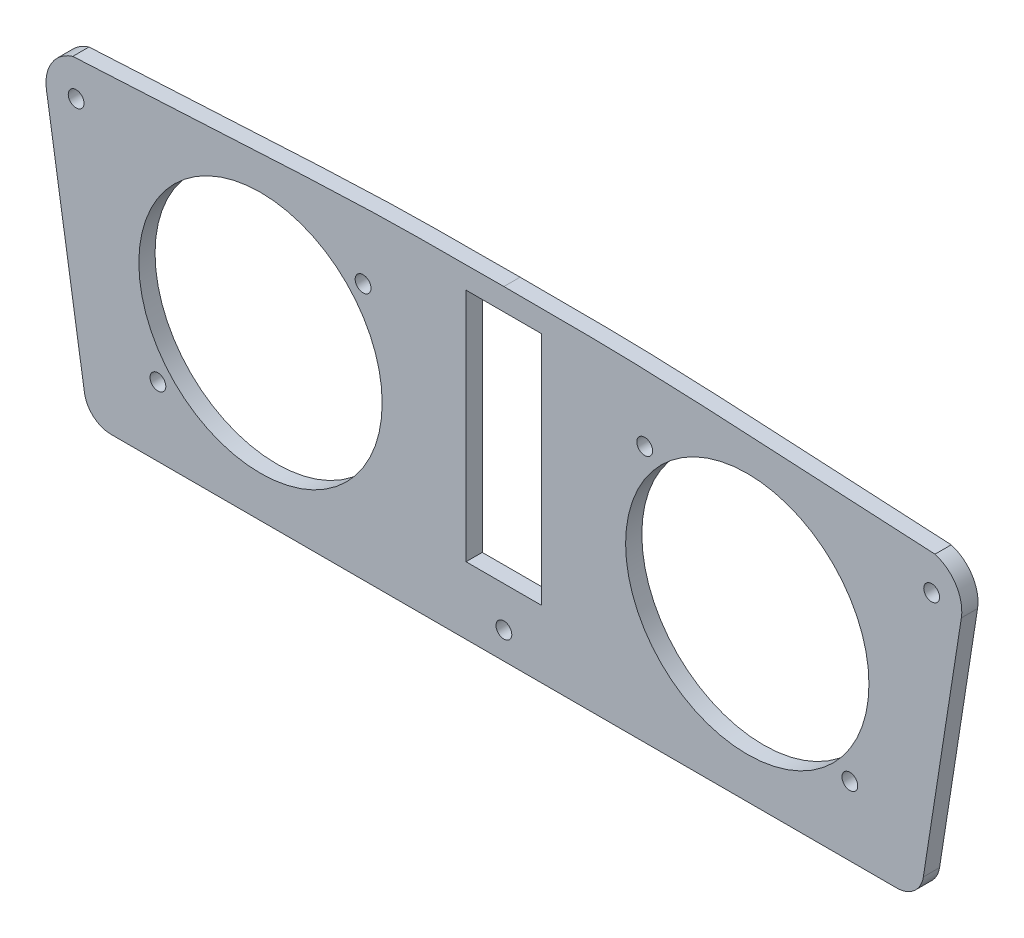
ISO-10303-21;
HEADER;
FILE_DESCRIPTION(('STEP AP214'),'2;1');
FILE_NAME('part.step','',(''),(''),'','','');
FILE_SCHEMA(('AUTOMOTIVE_DESIGN { 1 0 10303 214 1 1 1 1 }'));
ENDSEC;
DATA;
#1=APPLICATION_CONTEXT('core data for automotive mechanical design processes');
#2=APPLICATION_PROTOCOL_DEFINITION('international standard','automotive_design',2000,#1);
#3=PRODUCT_CONTEXT('',#1,'mechanical');
#4=PRODUCT('Part','Part','',(#3));
#5=PRODUCT_RELATED_PRODUCT_CATEGORY('part','',(#4));
#6=PRODUCT_DEFINITION_FORMATION('','',#4);
#7=PRODUCT_DEFINITION_CONTEXT('part definition',#1,'design');
#8=PRODUCT_DEFINITION('design','',#6,#7);
#9=PRODUCT_DEFINITION_SHAPE('','',#8);
#10=(LENGTH_UNIT() NAMED_UNIT(*) SI_UNIT(.MILLI.,.METRE.));
#11=(NAMED_UNIT(*) PLANE_ANGLE_UNIT() SI_UNIT($,.RADIAN.));
#12=(NAMED_UNIT(*) SI_UNIT($,.STERADIAN.) SOLID_ANGLE_UNIT());
#13=UNCERTAINTY_MEASURE_WITH_UNIT(LENGTH_MEASURE(1.E-05),#10,'distance_accuracy_value','');
#14=(GEOMETRIC_REPRESENTATION_CONTEXT(3) GLOBAL_UNCERTAINTY_ASSIGNED_CONTEXT((#13)) GLOBAL_UNIT_ASSIGNED_CONTEXT((#10,
#11,#12)) REPRESENTATION_CONTEXT('',''));
#15=CARTESIAN_POINT('',(0.,0.,0.));
#16=DIRECTION('',(0.,0.,1.));
#17=DIRECTION('',(1.,0.,0.));
#18=AXIS2_PLACEMENT_3D('',#15,#16,#17);
#19=CARTESIAN_POINT('',(77.6729384432531,7.59154105312176,3.));
#20=DIRECTION('',(0.,0.,1.));
#21=DIRECTION('',(1.,0.,0.));
#22=AXIS2_PLACEMENT_3D('',#19,#20,#21);
#23=PLANE('',#22);
#24=DIRECTION('',(0.,1.,0.));
#25=VECTOR('',#24,1.);
#26=CARTESIAN_POINT('',(7.,-30.2884590840889,3.));
#27=LINE('',#26,#25);
#28=CARTESIAN_POINT('',(7.,-30.2884590840889,3.));
#29=VERTEX_POINT('',#28);
#30=CARTESIAN_POINT('',(6.99999999999999,13.2106393625238,3.));
#31=VERTEX_POINT('',#30);
#32=EDGE_CURVE('E48',#29,#31,#27,.T.);
#33=ORIENTED_EDGE('',*,*,#32,.F.);
#34=DIRECTION('',(1.,0.,0.));
#35=VECTOR('',#34,1.);
#36=CARTESIAN_POINT('',(-7.,-30.2884590840889,3.));
#37=LINE('',#36,#35);
#38=CARTESIAN_POINT('',(-7.,-30.2884590840889,3.));
#39=VERTEX_POINT('',#38);
#40=EDGE_CURVE('E146',#39,#29,#37,.T.);
#41=ORIENTED_EDGE('',*,*,#40,.F.);
#42=DIRECTION('',(0.,-1.,0.));
#43=VECTOR('',#42,1.);
#44=CARTESIAN_POINT('',(-7.00000000000001,13.2106393625237,3.));
#45=LINE('',#44,#43);
#46=CARTESIAN_POINT('',(-7.00000000000001,13.2106393625237,3.));
#47=VERTEX_POINT('',#46);
#48=EDGE_CURVE('E131',#47,#39,#45,.T.);
#49=ORIENTED_EDGE('',*,*,#48,.F.);
#50=DIRECTION('',(-1.,0.,0.));
#51=VECTOR('',#50,1.);
#52=CARTESIAN_POINT('',(0.,13.2106393625237,3.));
#53=LINE('',#52,#51);
#54=EDGE_CURVE('E139',#31,#47,#53,.T.);
#55=ORIENTED_EDGE('',*,*,#54,.F.);
#56=EDGE_LOOP('',(#33,#41,#49,#55));
#57=FACE_BOUND('',#56,.T.);
#58=CARTESIAN_POINT('',(79.0964854551662,7.80060452720305,3.));
#59=DIRECTION('',(0.,0.,-1.));
#60=DIRECTION('',(-1.,0.,0.));
#61=AXIS2_PLACEMENT_3D('',#58,#59,#60);
#62=CIRCLE('',#61,1.46049999999999);
#63=CARTESIAN_POINT('',(77.6359854551662,7.80060452720305,3.));
#64=VERTEX_POINT('',#63);
#65=EDGE_CURVE('E158',#64,#64,#62,.T.);
#66=ORIENTED_EDGE('',*,*,#65,.T.);
#67=EDGE_LOOP('',(#66));
#68=FACE_BOUND('',#67,.T.);
#69=CARTESIAN_POINT('',(77.6729384432531,7.59154105312176,3.));
#70=DIRECTION('',(0.,0.,1.));
#71=DIRECTION('',(1.,0.,0.));
#72=AXIS2_PLACEMENT_3D('',#69,#70,#71);
#73=CIRCLE('',#72,7.);
#74=CARTESIAN_POINT('',(84.5890874100609,6.51131724810564,3.));
#75=VERTEX_POINT('',#74);
#76=CARTESIAN_POINT('',(79.7182282278267,14.2860753683015,3.));
#77=VERTEX_POINT('',#76);
#78=EDGE_CURVE('E210',#75,#77,#73,.T.);
#79=ORIENTED_EDGE('',*,*,#78,.T.);
#80=CARTESIAN_POINT('',(79.7182282278267,14.2860753683015,3.));
#81=CARTESIAN_POINT('',(25.,17.2860753683015,3.));
#82=CARTESIAN_POINT('',(0.,17.2860753683015,3.));
#83=(BOUNDED_CURVE() B_SPLINE_CURVE(2,(#80,#81,#82),.UNSPECIFIED.,.F.,
.F.) B_SPLINE_CURVE_WITH_KNOTS((3,3),(0.,1.),
.UNSPECIFIED.) CURVE() GEOMETRIC_REPRESENTATION_ITEM() RATIONAL_B_SPLINE_CURVE((1.,3.,1.)) REPRESENTATION_ITEM(''));
#84=CARTESIAN_POINT('',(0.,17.2860753683015,3.));
#85=VERTEX_POINT('',#84);
#86=EDGE_CURVE('E213',#77,#85,#83,.T.);
#87=ORIENTED_EDGE('',*,*,#86,.T.);
#88=CARTESIAN_POINT('',(-79.7182282278267,14.2860753683015,3.));
#89=CARTESIAN_POINT('',(-25.,17.2860753683015,3.));
#90=CARTESIAN_POINT('',(0.,17.2860753683015,3.));
#91=(BOUNDED_CURVE() B_SPLINE_CURVE(2,(#88,#89,#90),.UNSPECIFIED.,.F.,
.F.) B_SPLINE_CURVE_WITH_KNOTS((3,3),(0.,1.),
.UNSPECIFIED.) CURVE() GEOMETRIC_REPRESENTATION_ITEM() RATIONAL_B_SPLINE_CURVE((1.,3.,1.)) REPRESENTATION_ITEM(''));
#92=CARTESIAN_POINT('',(-79.7182282278267,14.2860753683015,3.));
#93=VERTEX_POINT('',#92);
#94=EDGE_CURVE('E219',#93,#85,#91,.T.);
#95=ORIENTED_EDGE('',*,*,#94,.F.);
#96=CARTESIAN_POINT('',(-77.6729384432531,7.59154105312176,3.));
#97=DIRECTION('',(0.,0.,-1.));
#98=DIRECTION('',(-1.,0.,0.));
#99=AXIS2_PLACEMENT_3D('',#96,#97,#98);
#100=CIRCLE('',#99,7.);
#101=CARTESIAN_POINT('',(-84.5890874100609,6.51131724810564,3.));
#102=VERTEX_POINT('',#101);
#103=EDGE_CURVE('E386',#102,#93,#100,.T.);
#104=ORIENTED_EDGE('',*,*,#103,.F.);
#105=DIRECTION('',(-0.154317686430875,0.988021280972542,0.));
#106=VECTOR('',#105,1.);
#107=CARTESIAN_POINT('',(-77.5610943048627,-38.4855130638528,3.));
#108=LINE('',#107,#106);
#109=CARTESIAN_POINT('',(-77.5610943048627,-38.4855130638528,3.));
#110=VERTEX_POINT('',#109);
#111=EDGE_CURVE('E384',#110,#102,#108,.T.);
#112=ORIENTED_EDGE('',*,*,#111,.F.);
#113=CARTESIAN_POINT('',(-72.6209879,-37.7139246316985,3.));
#114=DIRECTION('',(0.,0.,1.));
#115=DIRECTION('',(1.,0.,0.));
#116=AXIS2_PLACEMENT_3D('',#113,#114,#115);
#117=CIRCLE('',#116,5.00000000000001);
#118=CARTESIAN_POINT('',(-72.6209879,-42.7139246316985,3.));
#119=VERTEX_POINT('',#118);
#120=EDGE_CURVE('E382',#110,#119,#117,.T.);
#121=ORIENTED_EDGE('',*,*,#120,.T.);
#122=DIRECTION('',(-1.,0.,0.));
#123=VECTOR('',#122,1.);
#124=CARTESIAN_POINT('',(72.6209879,-42.7139246316985,3.));
#125=LINE('',#124,#123);
#126=CARTESIAN_POINT('',(72.6209879,-42.7139246316985,3.));
#127=VERTEX_POINT('',#126);
#128=EDGE_CURVE('E379',#127,#119,#125,.T.);
#129=ORIENTED_EDGE('',*,*,#128,.F.);
#130=CARTESIAN_POINT('',(72.6209879,-37.7139246316985,3.));
#131=DIRECTION('',(0.,0.,-1.));
#132=DIRECTION('',(-1.,0.,0.));
#133=AXIS2_PLACEMENT_3D('',#130,#131,#132);
#134=CIRCLE('',#133,5.00000000000001);
#135=CARTESIAN_POINT('',(77.5610943048627,-38.4855130638528,3.));
#136=VERTEX_POINT('',#135);
#137=EDGE_CURVE('E376',#136,#127,#134,.T.);
#138=ORIENTED_EDGE('',*,*,#137,.F.);
#139=DIRECTION('',(0.154317686430875,0.988021280972542,0.));
#140=VECTOR('',#139,1.);
#141=CARTESIAN_POINT('',(77.5610943048627,-38.4855130638528,3.));
#142=LINE('',#141,#140);
#143=EDGE_CURVE('E340',#136,#75,#142,.T.);
#144=ORIENTED_EDGE('',*,*,#143,.T.);
#145=EDGE_LOOP('',(#79,#87,#95,#104,#112,#121,#129,#138,#144));
#146=FACE_BOUND('',#145,.T.);
#147=CARTESIAN_POINT('',(-45.0049677878614,-12.6314974895042,3.));
#148=DIRECTION('',(0.,0.,1.));
#149=DIRECTION('',(1.,0.,0.));
#150=AXIS2_PLACEMENT_3D('',#147,#148,#149);
#151=CIRCLE('',#150,22.5000000000002);
#152=CARTESIAN_POINT('',(-22.5049677878613,-12.6314974895042,3.));
#153=VERTEX_POINT('',#152);
#154=EDGE_CURVE('E201',#153,#153,#151,.T.);
#155=ORIENTED_EDGE('',*,*,#154,.F.);
#156=EDGE_LOOP('',(#155));
#157=FACE_BOUND('',#156,.T.);
#158=CARTESIAN_POINT('',(45.0049677878612,-12.6314974895042,3.));
#159=DIRECTION('',(0.,0.,1.));
#160=DIRECTION('',(1.,0.,0.));
#161=AXIS2_PLACEMENT_3D('',#158,#159,#160);
#162=CIRCLE('',#161,22.4999999997435);
#163=CARTESIAN_POINT('',(67.5049677876047,-12.6314974895042,3.));
#164=VERTEX_POINT('',#163);
#165=EDGE_CURVE('E197',#164,#164,#162,.T.);
#166=ORIENTED_EDGE('',*,*,#165,.F.);
#167=EDGE_LOOP('',(#166));
#168=FACE_BOUND('',#167,.T.);
#169=CARTESIAN_POINT('',(63.9727498389549,-29.9725829244534,3.));
#170=DIRECTION('',(0.,0.,-1.));
#171=DIRECTION('',(-1.,0.,0.));
#172=AXIS2_PLACEMENT_3D('',#169,#170,#171);
#173=CIRCLE('',#172,1.46049999999999);
#174=CARTESIAN_POINT('',(62.5122498389549,-29.9725829244534,3.));
#175=VERTEX_POINT('',#174);
#176=EDGE_CURVE('E194',#175,#175,#173,.T.);
#177=ORIENTED_EDGE('',*,*,#176,.T.);
#178=EDGE_LOOP('',(#177));
#179=FACE_BOUND('',#178,.T.);
#180=CARTESIAN_POINT('',(26.0371857367675,4.70958794544504,3.));
#181=DIRECTION('',(0.,0.,-1.));
#182=DIRECTION('',(-1.,0.,0.));
#183=AXIS2_PLACEMENT_3D('',#180,#181,#182);
#184=CIRCLE('',#183,1.46049999999999);
#185=CARTESIAN_POINT('',(24.5766857367675,4.70958794544504,3.));
#186=VERTEX_POINT('',#185);
#187=EDGE_CURVE('E188',#186,#186,#184,.T.);
#188=ORIENTED_EDGE('',*,*,#187,.T.);
#189=EDGE_LOOP('',(#188));
#190=FACE_BOUND('',#189,.T.);
#191=CARTESIAN_POINT('',(-63.9727498389549,-29.9725829244534,3.));
#192=DIRECTION('',(0.,0.,-1.));
#193=DIRECTION('',(-1.,0.,0.));
#194=AXIS2_PLACEMENT_3D('',#191,#192,#193);
#195=CIRCLE('',#194,1.46049999999999);
#196=CARTESIAN_POINT('',(-65.4332498389549,-29.9725829244534,3.));
#197=VERTEX_POINT('',#196);
#198=EDGE_CURVE('E182',#197,#197,#195,.T.);
#199=ORIENTED_EDGE('',*,*,#198,.T.);
#200=EDGE_LOOP('',(#199));
#201=FACE_BOUND('',#200,.T.);
#202=CARTESIAN_POINT('',(-26.0371857367678,4.70958794544512,3.));
#203=DIRECTION('',(0.,0.,-1.));
#204=DIRECTION('',(-1.,0.,0.));
#205=AXIS2_PLACEMENT_3D('',#202,#203,#204);
#206=CIRCLE('',#205,1.46049999999999);
#207=CARTESIAN_POINT('',(-27.4976857367678,4.70958794544512,3.));
#208=VERTEX_POINT('',#207);
#209=EDGE_CURVE('E176',#208,#208,#206,.T.);
#210=ORIENTED_EDGE('',*,*,#209,.T.);
#211=EDGE_LOOP('',(#210));
#212=FACE_BOUND('',#211,.T.);
#213=CARTESIAN_POINT('',(0.,-37.7139246316985,3.));
#214=DIRECTION('',(0.,0.,-1.));
#215=DIRECTION('',(-1.,0.,0.));
#216=AXIS2_PLACEMENT_3D('',#213,#214,#215);
#217=CIRCLE('',#216,1.46049999999999);
#218=CARTESIAN_POINT('',(-1.46049999999999,-37.7139246316985,3.));
#219=VERTEX_POINT('',#218);
#220=EDGE_CURVE('E170',#219,#219,#217,.T.);
#221=ORIENTED_EDGE('',*,*,#220,.T.);
#222=EDGE_LOOP('',(#221));
#223=FACE_BOUND('',#222,.T.);
#224=CARTESIAN_POINT('',(-79.0964854551671,7.80060452721007,3.));
#225=DIRECTION('',(0.,0.,-1.));
#226=DIRECTION('',(-1.,0.,0.));
#227=AXIS2_PLACEMENT_3D('',#224,#225,#226);
#228=CIRCLE('',#227,1.46049999999999);
#229=CARTESIAN_POINT('',(-80.5569854551671,7.80060452721007,3.));
#230=VERTEX_POINT('',#229);
#231=EDGE_CURVE('E164',#230,#230,#228,.T.);
#232=ORIENTED_EDGE('',*,*,#231,.T.);
#233=EDGE_LOOP('',(#232));
#234=FACE_BOUND('',#233,.T.);
#235=ADVANCED_FACE('F33',(#57,#68,#146,#157,#168,#179,#190,#201,#212,#223,#234),#23,.T.);
#236=CARTESIAN_POINT('',(77.6729384432531,7.59154105312176,0.));
#237=DIRECTION('',(0.,0.,1.));
#238=DIRECTION('',(1.,0.,0.));
#239=AXIS2_PLACEMENT_3D('',#236,#237,#238);
#240=PLANE('',#239);
#241=DIRECTION('',(1.,0.,0.));
#242=VECTOR('',#241,1.);
#243=CARTESIAN_POINT('',(77.6729384432531,-30.2884590840889,0.));
#244=LINE('',#243,#242);
#245=CARTESIAN_POINT('',(-7.,-30.2884590840889,0.));
#246=VERTEX_POINT('',#245);
#247=CARTESIAN_POINT('',(7.,-30.2884590840889,0.));
#248=VERTEX_POINT('',#247);
#249=EDGE_CURVE('E41',#246,#248,#244,.T.);
#250=ORIENTED_EDGE('',*,*,#249,.T.);
#251=DIRECTION('',(0.,1.,0.));
#252=VECTOR('',#251,1.);
#253=CARTESIAN_POINT('',(6.99999999999999,7.59154105312177,0.));
#254=LINE('',#253,#252);
#255=CARTESIAN_POINT('',(7.,13.2106393625237,0.));
#256=VERTEX_POINT('',#255);
#257=EDGE_CURVE('E11',#248,#256,#254,.T.);
#258=ORIENTED_EDGE('',*,*,#257,.T.);
#259=DIRECTION('',(-1.,0.,0.));
#260=VECTOR('',#259,1.);
#261=CARTESIAN_POINT('',(77.672938443253,13.2106393625242,0.));
#262=LINE('',#261,#260);
#263=CARTESIAN_POINT('',(-7.00000000000001,13.2106393625237,0.));
#264=VERTEX_POINT('',#263);
#265=EDGE_CURVE('E316',#256,#264,#262,.T.);
#266=ORIENTED_EDGE('',*,*,#265,.T.);
#267=DIRECTION('',(0.,-1.,0.));
#268=VECTOR('',#267,1.);
#269=CARTESIAN_POINT('',(-7.00000000000001,7.59154105312175,0.));
#270=LINE('',#269,#268);
#271=EDGE_CURVE('E134',#264,#246,#270,.T.);
#272=ORIENTED_EDGE('',*,*,#271,.T.);
#273=EDGE_LOOP('',(#250,#258,#266,#272));
#274=FACE_BOUND('',#273,.T.);
#275=CARTESIAN_POINT('',(79.0964854551662,7.80060452720305,0.));
#276=DIRECTION('',(0.,0.,-1.));
#277=DIRECTION('',(-1.,0.,0.));
#278=AXIS2_PLACEMENT_3D('',#275,#276,#277);
#279=CIRCLE('',#278,1.46049999999999);
#280=CARTESIAN_POINT('',(77.6359854551662,7.80060452720305,0.));
#281=VERTEX_POINT('',#280);
#282=EDGE_CURVE('E152',#281,#281,#279,.T.);
#283=ORIENTED_EDGE('',*,*,#282,.F.);
#284=EDGE_LOOP('',(#283));
#285=FACE_BOUND('',#284,.T.);
#286=CARTESIAN_POINT('',(-79.0964854551671,7.80060452721007,0.));
#287=DIRECTION('',(0.,0.,-1.));
#288=DIRECTION('',(-1.,0.,0.));
#289=AXIS2_PLACEMENT_3D('',#286,#287,#288);
#290=CIRCLE('',#289,1.46049999999999);
#291=CARTESIAN_POINT('',(-80.5569854551671,7.80060452721007,0.));
#292=VERTEX_POINT('',#291);
#293=EDGE_CURVE('E161',#292,#292,#290,.T.);
#294=ORIENTED_EDGE('',*,*,#293,.F.);
#295=EDGE_LOOP('',(#294));
#296=FACE_BOUND('',#295,.T.);
#297=CARTESIAN_POINT('',(0.,-37.7139246316985,0.));
#298=DIRECTION('',(0.,0.,-1.));
#299=DIRECTION('',(-1.,0.,0.));
#300=AXIS2_PLACEMENT_3D('',#297,#298,#299);
#301=CIRCLE('',#300,1.46049999999999);
#302=CARTESIAN_POINT('',(-1.46049999999999,-37.7139246316985,0.));
#303=VERTEX_POINT('',#302);
#304=EDGE_CURVE('E167',#303,#303,#301,.T.);
#305=ORIENTED_EDGE('',*,*,#304,.F.);
#306=EDGE_LOOP('',(#305));
#307=FACE_BOUND('',#306,.T.);
#308=CARTESIAN_POINT('',(-26.0371857367678,4.70958794544512,0.));
#309=DIRECTION('',(0.,0.,-1.));
#310=DIRECTION('',(-1.,0.,0.));
#311=AXIS2_PLACEMENT_3D('',#308,#309,#310);
#312=CIRCLE('',#311,1.46049999999999);
#313=CARTESIAN_POINT('',(-27.4976857367678,4.70958794544512,0.));
#314=VERTEX_POINT('',#313);
#315=EDGE_CURVE('E173',#314,#314,#312,.T.);
#316=ORIENTED_EDGE('',*,*,#315,.F.);
#317=EDGE_LOOP('',(#316));
#318=FACE_BOUND('',#317,.T.);
#319=CARTESIAN_POINT('',(-63.9727498389549,-29.9725829244534,0.));
#320=DIRECTION('',(0.,0.,-1.));
#321=DIRECTION('',(-1.,0.,0.));
#322=AXIS2_PLACEMENT_3D('',#319,#320,#321);
#323=CIRCLE('',#322,1.46049999999999);
#324=CARTESIAN_POINT('',(-65.4332498389549,-29.9725829244534,0.));
#325=VERTEX_POINT('',#324);
#326=EDGE_CURVE('E179',#325,#325,#323,.T.);
#327=ORIENTED_EDGE('',*,*,#326,.F.);
#328=EDGE_LOOP('',(#327));
#329=FACE_BOUND('',#328,.T.);
#330=CARTESIAN_POINT('',(45.0049677878612,-12.6314974895042,0.));
#331=DIRECTION('',(0.,0.,1.));
#332=DIRECTION('',(1.,0.,0.));
#333=AXIS2_PLACEMENT_3D('',#330,#331,#332);
#334=CIRCLE('',#333,22.4999999997435);
#335=CARTESIAN_POINT('',(67.5049677876047,-12.6314974895042,0.));
#336=VERTEX_POINT('',#335);
#337=EDGE_CURVE('E198',#336,#336,#334,.T.);
#338=ORIENTED_EDGE('',*,*,#337,.T.);
#339=EDGE_LOOP('',(#338));
#340=FACE_BOUND('',#339,.T.);
#341=CARTESIAN_POINT('',(-45.0049677878614,-12.6314974895042,0.));
#342=DIRECTION('',(0.,0.,1.));
#343=DIRECTION('',(1.,0.,0.));
#344=AXIS2_PLACEMENT_3D('',#341,#342,#343);
#345=CIRCLE('',#344,22.5000000000002);
#346=CARTESIAN_POINT('',(-22.5049677878613,-12.6314974895042,0.));
#347=VERTEX_POINT('',#346);
#348=EDGE_CURVE('E204',#347,#347,#345,.T.);
#349=ORIENTED_EDGE('',*,*,#348,.T.);
#350=EDGE_LOOP('',(#349));
#351=FACE_BOUND('',#350,.T.);
#352=CARTESIAN_POINT('',(77.6729384432531,7.59154105312176,0.));
#353=DIRECTION('',(0.,0.,1.));
#354=DIRECTION('',(1.,0.,0.));
#355=AXIS2_PLACEMENT_3D('',#352,#353,#354);
#356=CIRCLE('',#355,7.);
#357=CARTESIAN_POINT('',(84.5890874100609,6.51131724810564,0.));
#358=VERTEX_POINT('',#357);
#359=CARTESIAN_POINT('',(79.7182282278267,14.2860753683015,0.));
#360=VERTEX_POINT('',#359);
#361=EDGE_CURVE('E207',#358,#360,#356,.T.);
#362=ORIENTED_EDGE('',*,*,#361,.F.);
#363=DIRECTION('',(0.154317686430875,0.988021280972542,0.));
#364=VECTOR('',#363,1.);
#365=CARTESIAN_POINT('',(77.5610943048627,-38.4855130638528,0.));
#366=LINE('',#365,#364);
#367=CARTESIAN_POINT('',(77.5610943048627,-38.4855130638528,0.));
#368=VERTEX_POINT('',#367);
#369=EDGE_CURVE('E214',#368,#358,#366,.T.);
#370=ORIENTED_EDGE('',*,*,#369,.F.);
#371=CARTESIAN_POINT('',(72.6209879,-37.7139246316985,0.));
#372=DIRECTION('',(0.,0.,-1.));
#373=DIRECTION('',(-1.,0.,0.));
#374=AXIS2_PLACEMENT_3D('',#371,#372,#373);
#375=CIRCLE('',#374,5.00000000000001);
#376=CARTESIAN_POINT('',(72.6209879,-42.7139246316985,0.));
#377=VERTEX_POINT('',#376);
#378=EDGE_CURVE('E342',#368,#377,#375,.T.);
#379=ORIENTED_EDGE('',*,*,#378,.T.);
#380=DIRECTION('',(-1.,0.,0.));
#381=VECTOR('',#380,1.);
#382=CARTESIAN_POINT('',(72.6209879,-42.7139246316985,0.));
#383=LINE('',#382,#381);
#384=CARTESIAN_POINT('',(-72.6209879,-42.7139246316985,0.));
#385=VERTEX_POINT('',#384);
#386=EDGE_CURVE('E345',#377,#385,#383,.T.);
#387=ORIENTED_EDGE('',*,*,#386,.T.);
#388=CARTESIAN_POINT('',(-72.6209879,-37.7139246316985,0.));
#389=DIRECTION('',(0.,0.,1.));
#390=DIRECTION('',(1.,0.,0.));
#391=AXIS2_PLACEMENT_3D('',#388,#389,#390);
#392=CIRCLE('',#391,5.00000000000001);
#393=CARTESIAN_POINT('',(-77.5610943048627,-38.4855130638528,0.));
#394=VERTEX_POINT('',#393);
#395=EDGE_CURVE('E348',#394,#385,#392,.T.);
#396=ORIENTED_EDGE('',*,*,#395,.F.);
#397=DIRECTION('',(-0.154317686430875,0.988021280972542,0.));
#398=VECTOR('',#397,1.);
#399=CARTESIAN_POINT('',(-77.5610943048627,-38.4855130638528,0.));
#400=LINE('',#399,#398);
#401=CARTESIAN_POINT('',(-84.5890874100609,6.51131724810564,0.));
#402=VERTEX_POINT('',#401);
#403=EDGE_CURVE('E351',#394,#402,#400,.T.);
#404=ORIENTED_EDGE('',*,*,#403,.T.);
#405=CARTESIAN_POINT('',(-77.6729384432531,7.59154105312176,0.));
#406=DIRECTION('',(0.,0.,-1.));
#407=DIRECTION('',(-1.,0.,0.));
#408=AXIS2_PLACEMENT_3D('',#405,#406,#407);
#409=CIRCLE('',#408,7.);
#410=CARTESIAN_POINT('',(-79.7182282278267,14.2860753683015,0.));
#411=VERTEX_POINT('',#410);
#412=EDGE_CURVE('E354',#402,#411,#409,.T.);
#413=ORIENTED_EDGE('',*,*,#412,.T.);
#414=CARTESIAN_POINT('',(-79.7182282278267,14.2860753683015,0.));
#415=CARTESIAN_POINT('',(-25.,17.2860753683015,0.));
#416=CARTESIAN_POINT('',(0.,17.2860753683015,0.));
#417=(BOUNDED_CURVE() B_SPLINE_CURVE(2,(#414,#415,#416),.UNSPECIFIED.,.F.,
.F.) B_SPLINE_CURVE_WITH_KNOTS((3,3),(0.,1.),
.UNSPECIFIED.) CURVE() GEOMETRIC_REPRESENTATION_ITEM() RATIONAL_B_SPLINE_CURVE((1.,3.,1.)) REPRESENTATION_ITEM(''));
#418=CARTESIAN_POINT('',(0.,17.2860753683015,0.));
#419=VERTEX_POINT('',#418);
#420=EDGE_CURVE('E357',#411,#419,#417,.T.);
#421=ORIENTED_EDGE('',*,*,#420,.T.);
#422=CARTESIAN_POINT('',(79.7182282278267,14.2860753683015,0.));
#423=CARTESIAN_POINT('',(25.,17.2860753683015,0.));
#424=CARTESIAN_POINT('',(0.,17.2860753683015,0.));
#425=(BOUNDED_CURVE() B_SPLINE_CURVE(2,(#422,#423,#424),.UNSPECIFIED.,.F.,
.F.) B_SPLINE_CURVE_WITH_KNOTS((3,3),(0.,1.),
.UNSPECIFIED.) CURVE() GEOMETRIC_REPRESENTATION_ITEM() RATIONAL_B_SPLINE_CURVE((1.,3.,1.)) REPRESENTATION_ITEM(''));
#426=EDGE_CURVE('E362',#360,#419,#425,.T.);
#427=ORIENTED_EDGE('',*,*,#426,.F.);
#428=EDGE_LOOP('',(#362,#370,#379,#387,#396,#404,#413,#421,#427));
#429=FACE_BOUND('',#428,.T.);
#430=CARTESIAN_POINT('',(63.9727498389549,-29.9725829244534,0.));
#431=DIRECTION('',(0.,0.,-1.));
#432=DIRECTION('',(-1.,0.,0.));
#433=AXIS2_PLACEMENT_3D('',#430,#431,#432);
#434=CIRCLE('',#433,1.46049999999999);
#435=CARTESIAN_POINT('',(62.5122498389549,-29.9725829244534,0.));
#436=VERTEX_POINT('',#435);
#437=EDGE_CURVE('E191',#436,#436,#434,.T.);
#438=ORIENTED_EDGE('',*,*,#437,.F.);
#439=EDGE_LOOP('',(#438));
#440=FACE_BOUND('',#439,.T.);
#441=CARTESIAN_POINT('',(26.0371857367675,4.70958794544504,0.));
#442=DIRECTION('',(0.,0.,-1.));
#443=DIRECTION('',(-1.,0.,0.));
#444=AXIS2_PLACEMENT_3D('',#441,#442,#443);
#445=CIRCLE('',#444,1.46049999999999);
#446=CARTESIAN_POINT('',(24.5766857367675,4.70958794544504,0.));
#447=VERTEX_POINT('',#446);
#448=EDGE_CURVE('E185',#447,#447,#445,.T.);
#449=ORIENTED_EDGE('',*,*,#448,.F.);
#450=EDGE_LOOP('',(#449));
#451=FACE_BOUND('',#450,.T.);
#452=ADVANCED_FACE('F260',(#274,#285,#296,#307,#318,#329,#340,#351,#429,#440,#451),#240,.F.);
#453=CARTESIAN_POINT('',(77.6729384432531,7.59154105312176,3.));
#454=DIRECTION('',(0.,0.,-1.));
#455=DIRECTION('',(-1.,0.,0.));
#456=AXIS2_PLACEMENT_3D('',#453,#454,#455);
#457=CYLINDRICAL_SURFACE('',#456,7.);
#458=ORIENTED_EDGE('',*,*,#361,.T.);
#459=DIRECTION('',(0.,0.,-1.));
#460=VECTOR('',#459,1.);
#461=CARTESIAN_POINT('',(79.7182282278267,14.2860753683015,3.));
#462=LINE('',#461,#460);
#463=EDGE_CURVE('E318',#77,#360,#462,.T.);
#464=ORIENTED_EDGE('',*,*,#463,.F.);
#465=ORIENTED_EDGE('',*,*,#78,.F.);
#466=DIRECTION('',(0.,0.,-1.));
#467=VECTOR('',#466,1.);
#468=CARTESIAN_POINT('',(84.5890874100609,6.51131724810564,3.));
#469=LINE('',#468,#467);
#470=EDGE_CURVE('E337',#75,#358,#469,.T.);
#471=ORIENTED_EDGE('',*,*,#470,.T.);
#472=EDGE_LOOP('',(#458,#464,#465,#471));
#473=FACE_BOUND('',#472,.T.);
#474=ADVANCED_FACE('F35',(#473),#457,.T.);
#475=DIRECTION('',(0.,0.,-1.));
#476=VECTOR('',#475,1.);
#477=SURFACE_OF_LINEAR_EXTRUSION('',#83,#476);
#478=ORIENTED_EDGE('',*,*,#426,.T.);
#479=DIRECTION('',(0.,0.,-1.));
#480=VECTOR('',#479,1.);
#481=CARTESIAN_POINT('',(0.,17.2860753683015,3.));
#482=LINE('',#481,#480);
#483=EDGE_CURVE('E323',#85,#419,#482,.T.);
#484=ORIENTED_EDGE('',*,*,#483,.F.);
#485=ORIENTED_EDGE('',*,*,#86,.F.);
#486=ORIENTED_EDGE('',*,*,#463,.T.);
#487=EDGE_LOOP('',(#478,#484,#485,#486));
#488=FACE_BOUND('',#487,.T.);
#489=ADVANCED_FACE('F227',(#488),#477,.F.);
#490=DIRECTION('',(0.,0.,-1.));
#491=VECTOR('',#490,1.);
#492=SURFACE_OF_LINEAR_EXTRUSION('',#91,#491);
#493=ORIENTED_EDGE('',*,*,#420,.F.);
#494=DIRECTION('',(0.,0.,-1.));
#495=VECTOR('',#494,1.);
#496=CARTESIAN_POINT('',(-79.7182282278267,14.2860753683015,3.));
#497=LINE('',#496,#495);
#498=EDGE_CURVE('E325',#93,#411,#497,.T.);
#499=ORIENTED_EDGE('',*,*,#498,.F.);
#500=ORIENTED_EDGE('',*,*,#94,.T.);
#501=ORIENTED_EDGE('',*,*,#483,.T.);
#502=EDGE_LOOP('',(#493,#499,#500,#501));
#503=FACE_BOUND('',#502,.T.);
#504=ADVANCED_FACE('F230',(#503),#492,.T.);
#505=CARTESIAN_POINT('',(-77.6729384432531,7.59154105312176,3.));
#506=DIRECTION('',(0.,0.,-1.));
#507=DIRECTION('',(-1.,0.,0.));
#508=AXIS2_PLACEMENT_3D('',#505,#506,#507);
#509=CYLINDRICAL_SURFACE('',#508,7.);
#510=ORIENTED_EDGE('',*,*,#412,.F.);
#511=DIRECTION('',(0.,0.,-1.));
#512=VECTOR('',#511,1.);
#513=CARTESIAN_POINT('',(-84.5890874100609,6.51131724810564,3.));
#514=LINE('',#513,#512);
#515=EDGE_CURVE('E327',#102,#402,#514,.T.);
#516=ORIENTED_EDGE('',*,*,#515,.F.);
#517=ORIENTED_EDGE('',*,*,#103,.T.);
#518=ORIENTED_EDGE('',*,*,#498,.T.);
#519=EDGE_LOOP('',(#510,#516,#517,#518));
#520=FACE_BOUND('',#519,.T.);
#521=ADVANCED_FACE('F234',(#520),#509,.T.);
#522=CARTESIAN_POINT('',(-77.5610943048627,-38.4855130638528,3.));
#523=DIRECTION('',(-0.988021280972542,-0.154317686430875,0.));
#524=DIRECTION('',(0.154317686430875,-0.988021280972542,0.));
#525=AXIS2_PLACEMENT_3D('',#522,#523,#524);
#526=PLANE('',#525);
#527=ORIENTED_EDGE('',*,*,#403,.F.);
#528=DIRECTION('',(0.,0.,-1.));
#529=VECTOR('',#528,1.);
#530=CARTESIAN_POINT('',(-77.5610943048627,-38.4855130638528,3.));
#531=LINE('',#530,#529);
#532=EDGE_CURVE('E329',#110,#394,#531,.T.);
#533=ORIENTED_EDGE('',*,*,#532,.F.);
#534=ORIENTED_EDGE('',*,*,#111,.T.);
#535=ORIENTED_EDGE('',*,*,#515,.T.);
#536=EDGE_LOOP('',(#527,#533,#534,#535));
#537=FACE_BOUND('',#536,.T.);
#538=ADVANCED_FACE('F238',(#537),#526,.T.);
#539=CARTESIAN_POINT('',(-72.6209879,-37.7139246316985,3.));
#540=DIRECTION('',(0.,0.,-1.));
#541=DIRECTION('',(-1.,0.,0.));
#542=AXIS2_PLACEMENT_3D('',#539,#540,#541);
#543=CYLINDRICAL_SURFACE('',#542,5.00000000000001);
#544=ORIENTED_EDGE('',*,*,#395,.T.);
#545=DIRECTION('',(0.,0.,-1.));
#546=VECTOR('',#545,1.);
#547=CARTESIAN_POINT('',(-72.6209879,-42.7139246316985,3.));
#548=LINE('',#547,#546);
#549=EDGE_CURVE('E331',#119,#385,#548,.T.);
#550=ORIENTED_EDGE('',*,*,#549,.F.);
#551=ORIENTED_EDGE('',*,*,#120,.F.);
#552=ORIENTED_EDGE('',*,*,#532,.T.);
#553=EDGE_LOOP('',(#544,#550,#551,#552));
#554=FACE_BOUND('',#553,.T.);
#555=ADVANCED_FACE('F242',(#554),#543,.T.);
#556=CARTESIAN_POINT('',(72.6209879,-42.7139246316985,3.));
#557=DIRECTION('',(0.,-1.,0.));
#558=DIRECTION('',(0.,0.,-1.));
#559=AXIS2_PLACEMENT_3D('',#556,#557,#558);
#560=PLANE('',#559);
#561=ORIENTED_EDGE('',*,*,#386,.F.);
#562=DIRECTION('',(0.,0.,-1.));
#563=VECTOR('',#562,1.);
#564=CARTESIAN_POINT('',(72.6209879,-42.7139246316985,3.));
#565=LINE('',#564,#563);
#566=EDGE_CURVE('E333',#127,#377,#565,.T.);
#567=ORIENTED_EDGE('',*,*,#566,.F.);
#568=ORIENTED_EDGE('',*,*,#128,.T.);
#569=ORIENTED_EDGE('',*,*,#549,.T.);
#570=EDGE_LOOP('',(#561,#567,#568,#569));
#571=FACE_BOUND('',#570,.T.);
#572=ADVANCED_FACE('F246',(#571),#560,.T.);
#573=CARTESIAN_POINT('',(72.6209879,-37.7139246316985,3.));
#574=DIRECTION('',(0.,0.,-1.));
#575=DIRECTION('',(-1.,0.,0.));
#576=AXIS2_PLACEMENT_3D('',#573,#574,#575);
#577=CYLINDRICAL_SURFACE('',#576,5.00000000000001);
#578=ORIENTED_EDGE('',*,*,#378,.F.);
#579=DIRECTION('',(0.,0.,-1.));
#580=VECTOR('',#579,1.);
#581=CARTESIAN_POINT('',(77.5610943048627,-38.4855130638528,3.));
#582=LINE('',#581,#580);
#583=EDGE_CURVE('E335',#136,#368,#582,.T.);
#584=ORIENTED_EDGE('',*,*,#583,.F.);
#585=ORIENTED_EDGE('',*,*,#137,.T.);
#586=ORIENTED_EDGE('',*,*,#566,.T.);
#587=EDGE_LOOP('',(#578,#584,#585,#586));
#588=FACE_BOUND('',#587,.T.);
#589=ADVANCED_FACE('F250',(#588),#577,.T.);
#590=CARTESIAN_POINT('',(77.5610943048627,-38.4855130638528,3.));
#591=DIRECTION('',(-0.988021280972542,0.154317686430875,0.));
#592=DIRECTION('',(-0.154317686430875,-0.988021280972542,0.));
#593=AXIS2_PLACEMENT_3D('',#590,#591,#592);
#594=PLANE('',#593);
#595=ORIENTED_EDGE('',*,*,#369,.T.);
#596=ORIENTED_EDGE('',*,*,#470,.F.);
#597=ORIENTED_EDGE('',*,*,#143,.F.);
#598=ORIENTED_EDGE('',*,*,#583,.T.);
#599=EDGE_LOOP('',(#595,#596,#597,#598));
#600=FACE_BOUND('',#599,.T.);
#601=ADVANCED_FACE('F254',(#600),#594,.F.);
#602=CARTESIAN_POINT('',(-45.0049677878614,-12.6314974895042,0.));
#603=DIRECTION('',(0.,0.,1.));
#604=DIRECTION('',(1.,0.,0.));
#605=AXIS2_PLACEMENT_3D('',#602,#603,#604);
#606=CYLINDRICAL_SURFACE('',#605,22.5000000000002);
#607=ORIENTED_EDGE('',*,*,#348,.F.);
#608=EDGE_LOOP('',(#607));
#609=FACE_BOUND('',#608,.T.);
#610=ORIENTED_EDGE('',*,*,#154,.T.);
#611=EDGE_LOOP('',(#610));
#612=FACE_BOUND('',#611,.T.);
#613=ADVANCED_FACE('F258',(#609,#612),#606,.F.);
#614=CARTESIAN_POINT('',(45.0049677878612,-12.6314974895042,0.));
#615=DIRECTION('',(0.,0.,1.));
#616=DIRECTION('',(1.,0.,0.));
#617=AXIS2_PLACEMENT_3D('',#614,#615,#616);
#618=CYLINDRICAL_SURFACE('',#617,22.4999999997435);
#619=ORIENTED_EDGE('',*,*,#337,.F.);
#620=EDGE_LOOP('',(#619));
#621=FACE_BOUND('',#620,.T.);
#622=ORIENTED_EDGE('',*,*,#165,.T.);
#623=EDGE_LOOP('',(#622));
#624=FACE_BOUND('',#623,.T.);
#625=ADVANCED_FACE('F268',(#621,#624),#618,.F.);
#626=CARTESIAN_POINT('',(63.9727498389549,-29.9725829244534,0.));
#627=DIRECTION('',(0.,0.,-1.));
#628=DIRECTION('',(-1.,0.,0.));
#629=AXIS2_PLACEMENT_3D('',#626,#627,#628);
#630=CYLINDRICAL_SURFACE('',#629,1.46049999999999);
#631=ORIENTED_EDGE('',*,*,#176,.F.);
#632=EDGE_LOOP('',(#631));
#633=FACE_BOUND('',#632,.T.);
#634=ORIENTED_EDGE('',*,*,#437,.T.);
#635=EDGE_LOOP('',(#634));
#636=FACE_BOUND('',#635,.T.);
#637=ADVANCED_FACE('F272',(#633,#636),#630,.F.);
#638=CARTESIAN_POINT('',(26.0371857367675,4.70958794544504,0.));
#639=DIRECTION('',(0.,0.,-1.));
#640=DIRECTION('',(-1.,0.,0.));
#641=AXIS2_PLACEMENT_3D('',#638,#639,#640);
#642=CYLINDRICAL_SURFACE('',#641,1.46049999999999);
#643=ORIENTED_EDGE('',*,*,#187,.F.);
#644=EDGE_LOOP('',(#643));
#645=FACE_BOUND('',#644,.T.);
#646=ORIENTED_EDGE('',*,*,#448,.T.);
#647=EDGE_LOOP('',(#646));
#648=FACE_BOUND('',#647,.T.);
#649=ADVANCED_FACE('F276',(#645,#648),#642,.F.);
#650=CARTESIAN_POINT('',(-63.9727498389549,-29.9725829244534,0.));
#651=DIRECTION('',(0.,0.,-1.));
#652=DIRECTION('',(-1.,0.,0.));
#653=AXIS2_PLACEMENT_3D('',#650,#651,#652);
#654=CYLINDRICAL_SURFACE('',#653,1.46049999999999);
#655=ORIENTED_EDGE('',*,*,#198,.F.);
#656=EDGE_LOOP('',(#655));
#657=FACE_BOUND('',#656,.T.);
#658=ORIENTED_EDGE('',*,*,#326,.T.);
#659=EDGE_LOOP('',(#658));
#660=FACE_BOUND('',#659,.T.);
#661=ADVANCED_FACE('F280',(#657,#660),#654,.F.);
#662=CARTESIAN_POINT('',(-26.0371857367678,4.70958794544512,0.));
#663=DIRECTION('',(0.,0.,-1.));
#664=DIRECTION('',(-1.,0.,0.));
#665=AXIS2_PLACEMENT_3D('',#662,#663,#664);
#666=CYLINDRICAL_SURFACE('',#665,1.46049999999999);
#667=ORIENTED_EDGE('',*,*,#209,.F.);
#668=EDGE_LOOP('',(#667));
#669=FACE_BOUND('',#668,.T.);
#670=ORIENTED_EDGE('',*,*,#315,.T.);
#671=EDGE_LOOP('',(#670));
#672=FACE_BOUND('',#671,.T.);
#673=ADVANCED_FACE('F284',(#669,#672),#666,.F.);
#674=CARTESIAN_POINT('',(0.,-37.7139246316985,0.));
#675=DIRECTION('',(0.,0.,-1.));
#676=DIRECTION('',(-1.,0.,0.));
#677=AXIS2_PLACEMENT_3D('',#674,#675,#676);
#678=CYLINDRICAL_SURFACE('',#677,1.46049999999999);
#679=ORIENTED_EDGE('',*,*,#220,.F.);
#680=EDGE_LOOP('',(#679));
#681=FACE_BOUND('',#680,.T.);
#682=ORIENTED_EDGE('',*,*,#304,.T.);
#683=EDGE_LOOP('',(#682));
#684=FACE_BOUND('',#683,.T.);
#685=ADVANCED_FACE('F288',(#681,#684),#678,.F.);
#686=CARTESIAN_POINT('',(-79.0964854551671,7.80060452721007,0.));
#687=DIRECTION('',(0.,0.,-1.));
#688=DIRECTION('',(-1.,0.,0.));
#689=AXIS2_PLACEMENT_3D('',#686,#687,#688);
#690=CYLINDRICAL_SURFACE('',#689,1.46049999999999);
#691=ORIENTED_EDGE('',*,*,#231,.F.);
#692=EDGE_LOOP('',(#691));
#693=FACE_BOUND('',#692,.T.);
#694=ORIENTED_EDGE('',*,*,#293,.T.);
#695=EDGE_LOOP('',(#694));
#696=FACE_BOUND('',#695,.T.);
#697=ADVANCED_FACE('F292',(#693,#696),#690,.F.);
#698=CARTESIAN_POINT('',(79.0964854551662,7.80060452720305,0.));
#699=DIRECTION('',(0.,0.,-1.));
#700=DIRECTION('',(-1.,0.,0.));
#701=AXIS2_PLACEMENT_3D('',#698,#699,#700);
#702=CYLINDRICAL_SURFACE('',#701,1.46049999999999);
#703=ORIENTED_EDGE('',*,*,#65,.F.);
#704=EDGE_LOOP('',(#703));
#705=FACE_BOUND('',#704,.T.);
#706=ORIENTED_EDGE('',*,*,#282,.T.);
#707=EDGE_LOOP('',(#706));
#708=FACE_BOUND('',#707,.T.);
#709=ADVANCED_FACE('F296',(#705,#708),#702,.F.);
#710=CARTESIAN_POINT('',(7.,-30.2884590840889,-7.));
#711=DIRECTION('',(1.,0.,0.));
#712=DIRECTION('',(0.,1.,0.));
#713=AXIS2_PLACEMENT_3D('',#710,#711,#712);
#714=PLANE('',#713);
#715=DIRECTION('',(0.,0.,1.));
#716=VECTOR('',#715,1.);
#717=CARTESIAN_POINT('',(7.,-30.2884590840889,-7.));
#718=LINE('',#717,#716);
#719=EDGE_CURVE('E153',#248,#29,#718,.T.);
#720=ORIENTED_EDGE('',*,*,#719,.T.);
#721=ORIENTED_EDGE('',*,*,#32,.T.);
#722=DIRECTION('',(0.,0.,1.));
#723=VECTOR('',#722,1.);
#724=CARTESIAN_POINT('',(7.,13.2106393625237,-7.));
#725=LINE('',#724,#723);
#726=EDGE_CURVE('E141',#256,#31,#725,.T.);
#727=ORIENTED_EDGE('',*,*,#726,.F.);
#728=ORIENTED_EDGE('',*,*,#257,.F.);
#729=EDGE_LOOP('',(#720,#721,#727,#728));
#730=FACE_BOUND('',#729,.T.);
#731=ADVANCED_FACE('F300',(#730),#714,.F.);
#732=CARTESIAN_POINT('',(-7.,-30.2884590840889,-7.));
#733=DIRECTION('',(0.,-1.,0.));
#734=DIRECTION('',(0.,0.,-1.));
#735=AXIS2_PLACEMENT_3D('',#732,#733,#734);
#736=PLANE('',#735);
#737=DIRECTION('',(0.,0.,1.));
#738=VECTOR('',#737,1.);
#739=CARTESIAN_POINT('',(-7.,-30.2884590840889,-7.));
#740=LINE('',#739,#738);
#741=EDGE_CURVE('E136',#246,#39,#740,.T.);
#742=ORIENTED_EDGE('',*,*,#741,.T.);
#743=ORIENTED_EDGE('',*,*,#40,.T.);
#744=ORIENTED_EDGE('',*,*,#719,.F.);
#745=ORIENTED_EDGE('',*,*,#249,.F.);
#746=EDGE_LOOP('',(#742,#743,#744,#745));
#747=FACE_BOUND('',#746,.T.);
#748=ADVANCED_FACE('F306',(#747),#736,.F.);
#749=CARTESIAN_POINT('',(-7.00000000000001,13.2106393625237,-7.));
#750=DIRECTION('',(-1.,0.,0.));
#751=DIRECTION('',(0.,-1.,0.));
#752=AXIS2_PLACEMENT_3D('',#749,#750,#751);
#753=PLANE('',#752);
#754=DIRECTION('',(0.,0.,1.));
#755=VECTOR('',#754,1.);
#756=CARTESIAN_POINT('',(-7.00000000000001,13.2106393625237,-7.));
#757=LINE('',#756,#755);
#758=EDGE_CURVE('E56',#264,#47,#757,.T.);
#759=ORIENTED_EDGE('',*,*,#758,.T.);
#760=ORIENTED_EDGE('',*,*,#48,.T.);
#761=ORIENTED_EDGE('',*,*,#741,.F.);
#762=ORIENTED_EDGE('',*,*,#271,.F.);
#763=EDGE_LOOP('',(#759,#760,#761,#762));
#764=FACE_BOUND('',#763,.T.);
#765=ADVANCED_FACE('F128',(#764),#753,.F.);
#766=CARTESIAN_POINT('',(0.,13.2106393625237,-7.));
#767=DIRECTION('',(0.,1.,0.));
#768=DIRECTION('',(-1.,0.,0.));
#769=AXIS2_PLACEMENT_3D('',#766,#767,#768);
#770=PLANE('',#769);
#771=ORIENTED_EDGE('',*,*,#726,.T.);
#772=ORIENTED_EDGE('',*,*,#54,.T.);
#773=ORIENTED_EDGE('',*,*,#758,.F.);
#774=ORIENTED_EDGE('',*,*,#265,.F.);
#775=EDGE_LOOP('',(#771,#772,#773,#774));
#776=FACE_BOUND('',#775,.T.);
#777=ADVANCED_FACE('F140',(#776),#770,.F.);
#778=CLOSED_SHELL('',(#235,#452,#474,#489,#504,#521,#538,#555,#572,#589,#601,#613,#625,#637,
#649,#661,#673,#685,#697,#709,#731,#748,#765,#777));
#779=MANIFOLD_SOLID_BREP('B2',#778);
#780=ADVANCED_BREP_SHAPE_REPRESENTATION('',(#18,#779),#14);
#781=SHAPE_DEFINITION_REPRESENTATION(#9,#780);
ENDSEC;
END-ISO-10303-21;
